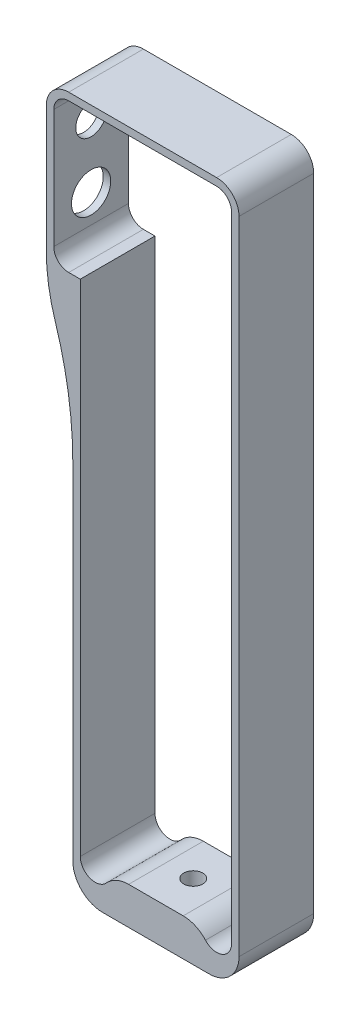
ISO-10303-21;
HEADER;
FILE_DESCRIPTION(('STEP AP214'),'2;1');
FILE_NAME('part.step','',(''),(''),'','','');
FILE_SCHEMA(('AUTOMOTIVE_DESIGN { 1 0 10303 214 1 1 1 1 }'));
ENDSEC;
DATA;
#1=APPLICATION_CONTEXT('core data for automotive mechanical design processes');
#2=APPLICATION_PROTOCOL_DEFINITION('international standard','automotive_design',2000,#1);
#3=PRODUCT_CONTEXT('',#1,'mechanical');
#4=PRODUCT('Part','Part','',(#3));
#5=PRODUCT_RELATED_PRODUCT_CATEGORY('part','',(#4));
#6=PRODUCT_DEFINITION_FORMATION('','',#4);
#7=PRODUCT_DEFINITION_CONTEXT('part definition',#1,'design');
#8=PRODUCT_DEFINITION('design','',#6,#7);
#9=PRODUCT_DEFINITION_SHAPE('','',#8);
#10=(LENGTH_UNIT() NAMED_UNIT(*) SI_UNIT(.MILLI.,.METRE.));
#11=(NAMED_UNIT(*) PLANE_ANGLE_UNIT() SI_UNIT($,.RADIAN.));
#12=(NAMED_UNIT(*) SI_UNIT($,.STERADIAN.) SOLID_ANGLE_UNIT());
#13=UNCERTAINTY_MEASURE_WITH_UNIT(LENGTH_MEASURE(1.E-05),#10,'distance_accuracy_value','');
#14=(GEOMETRIC_REPRESENTATION_CONTEXT(3) GLOBAL_UNCERTAINTY_ASSIGNED_CONTEXT((#13)) GLOBAL_UNIT_ASSIGNED_CONTEXT((#10,
#11,#12)) REPRESENTATION_CONTEXT('',''));
#15=CARTESIAN_POINT('',(0.,0.,0.));
#16=DIRECTION('',(0.,0.,1.));
#17=DIRECTION('',(1.,0.,0.));
#18=AXIS2_PLACEMENT_3D('',#15,#16,#17);
#19=CARTESIAN_POINT('',(-2.,-10.,20.));
#20=DIRECTION('',(1.,0.,0.));
#21=DIRECTION('',(0.,0.,-1.));
#22=AXIS2_PLACEMENT_3D('',#19,#20,#21);
#23=PLANE('',#22);
#24=DIRECTION('',(0.,-1.,0.));
#25=VECTOR('',#24,1.);
#26=CARTESIAN_POINT('',(-2.,-10.,20.));
#27=LINE('',#26,#25);
#28=CARTESIAN_POINT('',(-2.,90.3974781399098,20.));
#29=VERTEX_POINT('',#28);
#30=CARTESIAN_POINT('',(-2.,-2.,20.));
#31=VERTEX_POINT('',#30);
#32=EDGE_CURVE('E227',#29,#31,#27,.T.);
#33=ORIENTED_EDGE('',*,*,#32,.F.);
#34=DIRECTION('',(0.,0.,1.));
#35=VECTOR('',#34,1.);
#36=CARTESIAN_POINT('',(-2.,90.3974781399098,20.));
#37=LINE('',#36,#35);
#38=CARTESIAN_POINT('',(-2.,90.3974781399098,0.));
#39=VERTEX_POINT('',#38);
#40=EDGE_CURVE('E277',#29,#39,#37,.F.);
#41=ORIENTED_EDGE('',*,*,#40,.T.);
#42=DIRECTION('',(0.,-1.,0.));
#43=VECTOR('',#42,1.);
#44=CARTESIAN_POINT('',(-2.,-10.,0.));
#45=LINE('',#44,#43);
#46=CARTESIAN_POINT('',(-2.,-2.,0.));
#47=VERTEX_POINT('',#46);
#48=EDGE_CURVE('E233',#39,#47,#45,.T.);
#49=ORIENTED_EDGE('',*,*,#48,.T.);
#50=DIRECTION('',(0.,0.,-1.));
#51=VECTOR('',#50,1.);
#52=CARTESIAN_POINT('',(-2.,-2.,20.));
#53=LINE('',#52,#51);
#54=EDGE_CURVE('E261',#47,#31,#53,.F.);
#55=ORIENTED_EDGE('',*,*,#54,.T.);
#56=EDGE_LOOP('',(#33,#41,#49,#55));
#57=FACE_BOUND('',#56,.T.);
#58=ADVANCED_FACE('F38',(#57),#23,.F.);
#59=CARTESIAN_POINT('',(0.,0.,20.));
#60=DIRECTION('',(0.,0.,-1.));
#61=DIRECTION('',(-1.,0.,0.));
#62=AXIS2_PLACEMENT_3D('',#59,#60,#61);
#63=PLANE('',#62);
#64=DIRECTION('',(0.,1.,0.));
#65=VECTOR('',#64,1.);
#66=CARTESIAN_POINT('',(42.5,-10.,20.));
#67=LINE('',#66,#65);
#68=CARTESIAN_POINT('',(42.5,-2.,20.));
#69=VERTEX_POINT('',#68);
#70=CARTESIAN_POINT('',(42.5,169.655153446206,20.));
#71=VERTEX_POINT('',#70);
#72=EDGE_CURVE('E239',#69,#71,#67,.T.);
#73=ORIENTED_EDGE('',*,*,#72,.T.);
#74=CARTESIAN_POINT('',(36.5,169.655153446206,20.));
#75=DIRECTION('',(0.,0.,1.));
#76=DIRECTION('',(1.,0.,0.));
#77=AXIS2_PLACEMENT_3D('',#74,#75,#76);
#78=CIRCLE('',#77,6.00000000000001);
#79=CARTESIAN_POINT('',(36.5,175.655153446206,20.));
#80=VERTEX_POINT('',#79);
#81=EDGE_CURVE('E216',#71,#80,#78,.T.);
#82=ORIENTED_EDGE('',*,*,#81,.T.);
#83=DIRECTION('',(-1.,0.,0.));
#84=VECTOR('',#83,1.);
#85=CARTESIAN_POINT('',(36.5,175.655153446206,20.));
#86=LINE('',#85,#84);
#87=CARTESIAN_POINT('',(-3.1,175.655153446206,20.));
#88=VERTEX_POINT('',#87);
#89=EDGE_CURVE('E403',#80,#88,#86,.T.);
#90=ORIENTED_EDGE('',*,*,#89,.T.);
#91=CARTESIAN_POINT('',(-3.1,169.655153446206,20.));
#92=DIRECTION('',(0.,0.,1.));
#93=DIRECTION('',(-1.,0.,0.));
#94=AXIS2_PLACEMENT_3D('',#91,#92,#93);
#95=CIRCLE('',#94,6.);
#96=CARTESIAN_POINT('',(-9.1,169.655153446206,20.));
#97=VERTEX_POINT('',#96);
#98=EDGE_CURVE('E406',#88,#97,#95,.T.);
#99=ORIENTED_EDGE('',*,*,#98,.T.);
#100=DIRECTION('',(0.,-1.,0.));
#101=VECTOR('',#100,1.);
#102=CARTESIAN_POINT('',(-9.1,155.,20.));
#103=LINE('',#102,#101);
#104=CARTESIAN_POINT('',(-9.1,136.,20.));
#105=VERTEX_POINT('',#104);
#106=EDGE_CURVE('E328',#97,#105,#103,.T.);
#107=ORIENTED_EDGE('',*,*,#106,.T.);
#108=CARTESIAN_POINT('',(40.9,136.,20.));
#109=DIRECTION('',(0.,0.,1.));
#110=DIRECTION('',(1.,0.,0.));
#111=AXIS2_PLACEMENT_3D('',#108,#109,#110);
#112=CIRCLE('',#111,50.);
#113=CARTESIAN_POINT('',(-6.73333333333333,120.79915937997,20.));
#114=VERTEX_POINT('',#113);
#115=EDGE_CURVE('E305',#105,#114,#112,.T.);
#116=ORIENTED_EDGE('',*,*,#115,.T.);
#117=CARTESIAN_POINT('',(-102.,90.3974781399098,20.));
#118=DIRECTION('',(0.,0.,-1.));
#119=DIRECTION('',(-1.,0.,0.));
#120=AXIS2_PLACEMENT_3D('',#117,#118,#119);
#121=CIRCLE('',#120,100.);
#122=EDGE_CURVE('E279',#114,#29,#121,.T.);
#123=ORIENTED_EDGE('',*,*,#122,.T.);
#124=ORIENTED_EDGE('',*,*,#32,.T.);
#125=CARTESIAN_POINT('',(6.,-2.,20.));
#126=DIRECTION('',(0.,0.,-1.));
#127=DIRECTION('',(-1.,0.,0.));
#128=AXIS2_PLACEMENT_3D('',#125,#126,#127);
#129=CIRCLE('',#128,8.);
#130=CARTESIAN_POINT('',(6.,-10.,20.));
#131=VERTEX_POINT('',#130);
#132=EDGE_CURVE('E257',#31,#131,#129,.F.);
#133=ORIENTED_EDGE('',*,*,#132,.T.);
#134=DIRECTION('',(1.,0.,0.));
#135=VECTOR('',#134,1.);
#136=CARTESIAN_POINT('',(-2.,-10.,20.));
#137=LINE('',#136,#135);
#138=CARTESIAN_POINT('',(34.5,-10.,20.));
#139=VERTEX_POINT('',#138);
#140=EDGE_CURVE('E230',#131,#139,#137,.T.);
#141=ORIENTED_EDGE('',*,*,#140,.T.);
#142=CARTESIAN_POINT('',(34.5,-2.,20.));
#143=DIRECTION('',(0.,0.,-1.));
#144=DIRECTION('',(-1.,0.,0.));
#145=AXIS2_PLACEMENT_3D('',#142,#143,#144);
#146=CIRCLE('',#145,8.);
#147=EDGE_CURVE('E259',#139,#69,#146,.F.);
#148=ORIENTED_EDGE('',*,*,#147,.T.);
#149=EDGE_LOOP('',(#73,#82,#90,#99,#107,#116,#123,#124,#133,#141,#148));
#150=FACE_BOUND('',#149,.T.);
#151=DIRECTION('',(0.,1.,0.));
#152=VECTOR('',#151,1.);
#153=CARTESIAN_POINT('',(-7.1,155.,20.));
#154=LINE('',#153,#152);
#155=CARTESIAN_POINT('',(-7.1,137.853274797294,20.));
#156=VERTEX_POINT('',#155);
#157=CARTESIAN_POINT('',(-7.1,169.655153446206,20.));
#158=VERTEX_POINT('',#157);
#159=EDGE_CURVE('E292',#156,#158,#154,.T.);
#160=ORIENTED_EDGE('',*,*,#159,.T.);
#161=CARTESIAN_POINT('',(-3.1,169.655153446206,20.));
#162=DIRECTION('',(0.,0.,-1.));
#163=DIRECTION('',(-1.,0.,0.));
#164=AXIS2_PLACEMENT_3D('',#161,#162,#163);
#165=CIRCLE('',#164,4.);
#166=CARTESIAN_POINT('',(-3.1,173.655153446206,20.));
#167=VERTEX_POINT('',#166);
#168=EDGE_CURVE('E53',#158,#167,#165,.T.);
#169=ORIENTED_EDGE('',*,*,#168,.T.);
#170=DIRECTION('',(1.,0.,0.));
#171=VECTOR('',#170,1.);
#172=CARTESIAN_POINT('',(-3.1,173.655153446206,20.));
#173=LINE('',#172,#171);
#174=CARTESIAN_POINT('',(36.5,173.655153446206,20.));
#175=VERTEX_POINT('',#174);
#176=EDGE_CURVE('E210',#167,#175,#173,.T.);
#177=ORIENTED_EDGE('',*,*,#176,.T.);
#178=CARTESIAN_POINT('',(36.5,169.655153446206,20.));
#179=DIRECTION('',(0.,0.,-1.));
#180=DIRECTION('',(1.,0.,0.));
#181=AXIS2_PLACEMENT_3D('',#178,#179,#180);
#182=CIRCLE('',#181,4.);
#183=CARTESIAN_POINT('',(40.5,169.655153446206,20.));
#184=VERTEX_POINT('',#183);
#185=EDGE_CURVE('E404',#175,#184,#182,.T.);
#186=ORIENTED_EDGE('',*,*,#185,.T.);
#187=DIRECTION('',(0.,1.,0.));
#188=VECTOR('',#187,1.);
#189=CARTESIAN_POINT('',(40.5,0.,20.));
#190=LINE('',#189,#188);
#191=CARTESIAN_POINT('',(40.5,0.,20.));
#192=VERTEX_POINT('',#191);
#193=EDGE_CURVE('E358',#192,#184,#190,.T.);
#194=ORIENTED_EDGE('',*,*,#193,.F.);
#195=CARTESIAN_POINT('',(36.5,0.,20.));
#196=DIRECTION('',(0.,0.,1.));
#197=DIRECTION('',(1.,0.,0.));
#198=AXIS2_PLACEMENT_3D('',#195,#196,#197);
#199=CIRCLE('',#198,4.);
#200=CARTESIAN_POINT('',(33.5185760300003,-2.66666666666667,20.));
#201=VERTEX_POINT('',#200);
#202=EDGE_CURVE('E356',#201,#192,#199,.T.);
#203=ORIENTED_EDGE('',*,*,#202,.F.);
#204=CARTESIAN_POINT('',(27.5557280900008,-8.,20.));
#205=DIRECTION('',(0.,0.,-1.));
#206=DIRECTION('',(-1.,0.,0.));
#207=AXIS2_PLACEMENT_3D('',#204,#205,#206);
#208=CIRCLE('',#207,8.);
#209=CARTESIAN_POINT('',(27.5557280900008,0.,20.));
#210=VERTEX_POINT('',#209);
#211=EDGE_CURVE('E255',#201,#210,#208,.F.);
#212=ORIENTED_EDGE('',*,*,#211,.T.);
#213=DIRECTION('',(1.,0.,0.));
#214=VECTOR('',#213,1.);
#215=CARTESIAN_POINT('',(8.,0.,20.));
#216=LINE('',#215,#214);
#217=CARTESIAN_POINT('',(12.9442719099992,0.,20.));
#218=VERTEX_POINT('',#217);
#219=EDGE_CURVE('E352',#218,#210,#216,.T.);
#220=ORIENTED_EDGE('',*,*,#219,.F.);
#221=CARTESIAN_POINT('',(12.9442719099992,-8.,20.));
#222=DIRECTION('',(0.,0.,-1.));
#223=DIRECTION('',(-1.,0.,0.));
#224=AXIS2_PLACEMENT_3D('',#221,#222,#223);
#225=CIRCLE('',#224,8.);
#226=CARTESIAN_POINT('',(6.98142396999972,-2.66666666666667,20.));
#227=VERTEX_POINT('',#226);
#228=EDGE_CURVE('E253',#218,#227,#225,.F.);
#229=ORIENTED_EDGE('',*,*,#228,.T.);
#230=CARTESIAN_POINT('',(4.,0.,20.));
#231=DIRECTION('',(0.,0.,1.));
#232=DIRECTION('',(1.,0.,0.));
#233=AXIS2_PLACEMENT_3D('',#230,#231,#232);
#234=CIRCLE('',#233,4.);
#235=CARTESIAN_POINT('',(0.,0.,20.));
#236=VERTEX_POINT('',#235);
#237=EDGE_CURVE('E349',#236,#227,#234,.T.);
#238=ORIENTED_EDGE('',*,*,#237,.F.);
#239=DIRECTION('',(0.,-1.,0.));
#240=VECTOR('',#239,1.);
#241=CARTESIAN_POINT('',(0.,0.,20.));
#242=LINE('',#241,#240);
#243=CARTESIAN_POINT('',(0.,133.853274797294,20.));
#244=VERTEX_POINT('',#243);
#245=EDGE_CURVE('E361',#244,#236,#242,.T.);
#246=ORIENTED_EDGE('',*,*,#245,.F.);
#247=DIRECTION('',(-1.,0.,0.));
#248=VECTOR('',#247,1.);
#249=CARTESIAN_POINT('',(-7.05197150174398,133.853274797294,20.));
#250=LINE('',#249,#248);
#251=CARTESIAN_POINT('',(-3.1,133.853274797294,20.));
#252=VERTEX_POINT('',#251);
#253=EDGE_CURVE('E294',#244,#252,#250,.T.);
#254=ORIENTED_EDGE('',*,*,#253,.T.);
#255=CARTESIAN_POINT('',(-3.1,137.853274797294,20.));
#256=DIRECTION('',(0.,0.,-1.));
#257=DIRECTION('',(-1.,0.,0.));
#258=AXIS2_PLACEMENT_3D('',#255,#256,#257);
#259=CIRCLE('',#258,4.);
#260=EDGE_CURVE('E46',#252,#156,#259,.T.);
#261=ORIENTED_EDGE('',*,*,#260,.T.);
#262=EDGE_LOOP('',(#160,#169,#177,#186,#194,#203,#212,#220,#229,#238,#246,#254,#261));
#263=FACE_BOUND('',#262,.T.);
#264=ADVANCED_FACE('F291',(#150,#263),#63,.F.);
#265=CARTESIAN_POINT('',(0.,0.,0.));
#266=DIRECTION('',(0.,0.,-1.));
#267=DIRECTION('',(-1.,0.,0.));
#268=AXIS2_PLACEMENT_3D('',#265,#266,#267);
#269=PLANE('',#268);
#270=CARTESIAN_POINT('',(36.5,169.655153446206,0.));
#271=DIRECTION('',(0.,0.,-1.));
#272=DIRECTION('',(-1.,0.,0.));
#273=AXIS2_PLACEMENT_3D('',#270,#271,#272);
#274=CIRCLE('',#273,6.00000000000001);
#275=CARTESIAN_POINT('',(42.5,169.655153446206,0.));
#276=VERTEX_POINT('',#275);
#277=CARTESIAN_POINT('',(36.5,175.655153446206,0.));
#278=VERTEX_POINT('',#277);
#279=EDGE_CURVE('E199',#276,#278,#274,.F.);
#280=ORIENTED_EDGE('',*,*,#279,.F.);
#281=DIRECTION('',(0.,1.,0.));
#282=VECTOR('',#281,1.);
#283=CARTESIAN_POINT('',(42.5,-10.,0.));
#284=LINE('',#283,#282);
#285=CARTESIAN_POINT('',(42.5,-2.,0.));
#286=VERTEX_POINT('',#285);
#287=EDGE_CURVE('E204',#286,#276,#284,.T.);
#288=ORIENTED_EDGE('',*,*,#287,.F.);
#289=CARTESIAN_POINT('',(34.5,-2.,0.));
#290=DIRECTION('',(0.,0.,-1.));
#291=DIRECTION('',(-1.,0.,0.));
#292=AXIS2_PLACEMENT_3D('',#289,#290,#291);
#293=CIRCLE('',#292,8.);
#294=CARTESIAN_POINT('',(34.5,-10.,0.));
#295=VERTEX_POINT('',#294);
#296=EDGE_CURVE('E246',#286,#295,#293,.T.);
#297=ORIENTED_EDGE('',*,*,#296,.T.);
#298=DIRECTION('',(1.,0.,0.));
#299=VECTOR('',#298,1.);
#300=CARTESIAN_POINT('',(-2.,-10.,0.));
#301=LINE('',#300,#299);
#302=CARTESIAN_POINT('',(6.,-10.,0.));
#303=VERTEX_POINT('',#302);
#304=EDGE_CURVE('E228',#303,#295,#301,.T.);
#305=ORIENTED_EDGE('',*,*,#304,.F.);
#306=CARTESIAN_POINT('',(6.,-2.,0.));
#307=DIRECTION('',(0.,0.,-1.));
#308=DIRECTION('',(-1.,0.,0.));
#309=AXIS2_PLACEMENT_3D('',#306,#307,#308);
#310=CIRCLE('',#309,8.);
#311=EDGE_CURVE('E243',#303,#47,#310,.T.);
#312=ORIENTED_EDGE('',*,*,#311,.T.);
#313=ORIENTED_EDGE('',*,*,#48,.F.);
#314=CARTESIAN_POINT('',(-102.,90.3974781399098,0.));
#315=DIRECTION('',(0.,0.,-1.));
#316=DIRECTION('',(-1.,0.,0.));
#317=AXIS2_PLACEMENT_3D('',#314,#315,#316);
#318=CIRCLE('',#317,100.);
#319=CARTESIAN_POINT('',(-6.73333333333333,120.79915937997,0.));
#320=VERTEX_POINT('',#319);
#321=EDGE_CURVE('E281',#39,#320,#318,.F.);
#322=ORIENTED_EDGE('',*,*,#321,.T.);
#323=CARTESIAN_POINT('',(40.9,136.,0.));
#324=DIRECTION('',(0.,0.,-1.));
#325=DIRECTION('',(-1.,0.,0.));
#326=AXIS2_PLACEMENT_3D('',#323,#324,#325);
#327=CIRCLE('',#326,50.);
#328=CARTESIAN_POINT('',(-9.1,136.,0.));
#329=VERTEX_POINT('',#328);
#330=EDGE_CURVE('E338',#329,#320,#327,.F.);
#331=ORIENTED_EDGE('',*,*,#330,.F.);
#332=DIRECTION('',(0.,-1.,0.));
#333=VECTOR('',#332,1.);
#334=CARTESIAN_POINT('',(-9.1,155.,0.));
#335=LINE('',#334,#333);
#336=CARTESIAN_POINT('',(-9.1,169.655153446206,0.));
#337=VERTEX_POINT('',#336);
#338=EDGE_CURVE('E304',#337,#329,#335,.T.);
#339=ORIENTED_EDGE('',*,*,#338,.F.);
#340=CARTESIAN_POINT('',(-3.1,169.655153446206,0.));
#341=DIRECTION('',(0.,0.,-1.));
#342=DIRECTION('',(-1.,0.,0.));
#343=AXIS2_PLACEMENT_3D('',#340,#341,#342);
#344=CIRCLE('',#343,6.);
#345=CARTESIAN_POINT('',(-3.1,175.655153446206,0.));
#346=VERTEX_POINT('',#345);
#347=EDGE_CURVE('E421',#346,#337,#344,.F.);
#348=ORIENTED_EDGE('',*,*,#347,.F.);
#349=DIRECTION('',(-1.,0.,0.));
#350=VECTOR('',#349,1.);
#351=CARTESIAN_POINT('',(36.5,175.655153446206,0.));
#352=LINE('',#351,#350);
#353=EDGE_CURVE('E206',#278,#346,#352,.T.);
#354=ORIENTED_EDGE('',*,*,#353,.F.);
#355=EDGE_LOOP('',(#280,#288,#297,#305,#312,#313,#322,#331,#339,#348,#354));
#356=FACE_BOUND('',#355,.T.);
#357=DIRECTION('',(0.,1.,0.));
#358=VECTOR('',#357,1.);
#359=CARTESIAN_POINT('',(40.5,0.,0.));
#360=LINE('',#359,#358);
#361=CARTESIAN_POINT('',(40.5,0.,0.));
#362=VERTEX_POINT('',#361);
#363=CARTESIAN_POINT('',(40.5,169.655153446206,0.));
#364=VERTEX_POINT('',#363);
#365=EDGE_CURVE('E371',#362,#364,#360,.T.);
#366=ORIENTED_EDGE('',*,*,#365,.T.);
#367=CARTESIAN_POINT('',(36.5,169.655153446206,0.));
#368=DIRECTION('',(0.,0.,-1.));
#369=DIRECTION('',(-1.,0.,0.));
#370=AXIS2_PLACEMENT_3D('',#367,#368,#369);
#371=CIRCLE('',#370,4.);
#372=CARTESIAN_POINT('',(36.5,173.655153446206,0.));
#373=VERTEX_POINT('',#372);
#374=EDGE_CURVE('E61',#373,#364,#371,.T.);
#375=ORIENTED_EDGE('',*,*,#374,.F.);
#376=DIRECTION('',(1.,0.,0.));
#377=VECTOR('',#376,1.);
#378=CARTESIAN_POINT('',(-3.1,173.655153446206,0.));
#379=LINE('',#378,#377);
#380=CARTESIAN_POINT('',(-3.1,173.655153446206,0.));
#381=VERTEX_POINT('',#380);
#382=EDGE_CURVE('E414',#381,#373,#379,.T.);
#383=ORIENTED_EDGE('',*,*,#382,.F.);
#384=CARTESIAN_POINT('',(-3.1,169.655153446206,0.));
#385=DIRECTION('',(0.,0.,-1.));
#386=DIRECTION('',(-1.,0.,0.));
#387=AXIS2_PLACEMENT_3D('',#384,#385,#386);
#388=CIRCLE('',#387,4.);
#389=CARTESIAN_POINT('',(-7.1,169.655153446206,0.));
#390=VERTEX_POINT('',#389);
#391=EDGE_CURVE('E418',#390,#381,#388,.T.);
#392=ORIENTED_EDGE('',*,*,#391,.F.);
#393=DIRECTION('',(0.,1.,0.));
#394=VECTOR('',#393,1.);
#395=CARTESIAN_POINT('',(-7.1,155.,0.));
#396=LINE('',#395,#394);
#397=CARTESIAN_POINT('',(-7.1,137.853274797294,0.));
#398=VERTEX_POINT('',#397);
#399=EDGE_CURVE('E313',#398,#390,#396,.T.);
#400=ORIENTED_EDGE('',*,*,#399,.F.);
#401=CARTESIAN_POINT('',(-3.1,137.853274797294,0.));
#402=DIRECTION('',(0.,0.,-1.));
#403=DIRECTION('',(-1.,0.,0.));
#404=AXIS2_PLACEMENT_3D('',#401,#402,#403);
#405=CIRCLE('',#404,4.);
#406=CARTESIAN_POINT('',(-3.1,133.853274797294,0.));
#407=VERTEX_POINT('',#406);
#408=EDGE_CURVE('E11',#398,#407,#405,.F.);
#409=ORIENTED_EDGE('',*,*,#408,.T.);
#410=DIRECTION('',(-1.,0.,0.));
#411=VECTOR('',#410,1.);
#412=CARTESIAN_POINT('',(-7.05197150174398,133.853274797294,0.));
#413=LINE('',#412,#411);
#414=CARTESIAN_POINT('',(0.,133.853274797294,0.));
#415=VERTEX_POINT('',#414);
#416=EDGE_CURVE('E311',#415,#407,#413,.T.);
#417=ORIENTED_EDGE('',*,*,#416,.F.);
#418=DIRECTION('',(0.,-1.,0.));
#419=VECTOR('',#418,1.);
#420=CARTESIAN_POINT('',(0.,0.,0.));
#421=LINE('',#420,#419);
#422=CARTESIAN_POINT('',(0.,0.,0.));
#423=VERTEX_POINT('',#422);
#424=EDGE_CURVE('E353',#415,#423,#421,.T.);
#425=ORIENTED_EDGE('',*,*,#424,.T.);
#426=CARTESIAN_POINT('',(4.,0.,0.));
#427=DIRECTION('',(0.,0.,1.));
#428=DIRECTION('',(1.,0.,0.));
#429=AXIS2_PLACEMENT_3D('',#426,#427,#428);
#430=CIRCLE('',#429,4.);
#431=CARTESIAN_POINT('',(6.98142396999972,-2.66666666666667,0.));
#432=VERTEX_POINT('',#431);
#433=EDGE_CURVE('E348',#423,#432,#430,.T.);
#434=ORIENTED_EDGE('',*,*,#433,.T.);
#435=CARTESIAN_POINT('',(12.9442719099992,-8.,0.));
#436=DIRECTION('',(0.,0.,-1.));
#437=DIRECTION('',(-1.,0.,0.));
#438=AXIS2_PLACEMENT_3D('',#435,#436,#437);
#439=CIRCLE('',#438,8.);
#440=CARTESIAN_POINT('',(12.9442719099992,0.,0.));
#441=VERTEX_POINT('',#440);
#442=EDGE_CURVE('E238',#432,#441,#439,.T.);
#443=ORIENTED_EDGE('',*,*,#442,.T.);
#444=DIRECTION('',(1.,0.,0.));
#445=VECTOR('',#444,1.);
#446=CARTESIAN_POINT('',(8.,0.,0.));
#447=LINE('',#446,#445);
#448=CARTESIAN_POINT('',(27.5557280900008,0.,0.));
#449=VERTEX_POINT('',#448);
#450=EDGE_CURVE('E366',#441,#449,#447,.T.);
#451=ORIENTED_EDGE('',*,*,#450,.T.);
#452=CARTESIAN_POINT('',(27.5557280900008,-8.,0.));
#453=DIRECTION('',(0.,0.,-1.));
#454=DIRECTION('',(-1.,0.,0.));
#455=AXIS2_PLACEMENT_3D('',#452,#453,#454);
#456=CIRCLE('',#455,8.);
#457=CARTESIAN_POINT('',(33.5185760300003,-2.66666666666667,0.));
#458=VERTEX_POINT('',#457);
#459=EDGE_CURVE('E241',#449,#458,#456,.T.);
#460=ORIENTED_EDGE('',*,*,#459,.T.);
#461=CARTESIAN_POINT('',(36.5,0.,0.));
#462=DIRECTION('',(0.,0.,1.));
#463=DIRECTION('',(1.,0.,0.));
#464=AXIS2_PLACEMENT_3D('',#461,#462,#463);
#465=CIRCLE('',#464,4.);
#466=EDGE_CURVE('E369',#458,#362,#465,.T.);
#467=ORIENTED_EDGE('',*,*,#466,.T.);
#468=EDGE_LOOP('',(#366,#375,#383,#392,#400,#409,#417,#425,#434,#443,#451,#460,#467));
#469=FACE_BOUND('',#468,.T.);
#470=ADVANCED_FACE('F201',(#356,#469),#269,.T.);
#471=CARTESIAN_POINT('',(-2.,-10.,20.));
#472=DIRECTION('',(0.,1.,0.));
#473=DIRECTION('',(-1.,0.,0.));
#474=AXIS2_PLACEMENT_3D('',#471,#472,#473);
#475=PLANE('',#474);
#476=CARTESIAN_POINT('',(20.25,-10.,10.));
#477=DIRECTION('',(0.,-1.,0.));
#478=DIRECTION('',(0.,0.,-1.));
#479=AXIS2_PLACEMENT_3D('',#476,#477,#478);
#480=CIRCLE('',#479,2.55269999999999);
#481=CARTESIAN_POINT('',(20.25,-10.,7.44730000000001));
#482=VERTEX_POINT('',#481);
#483=EDGE_CURVE('E337',#482,#482,#480,.T.);
#484=ORIENTED_EDGE('',*,*,#483,.F.);
#485=EDGE_LOOP('',(#484));
#486=FACE_BOUND('',#485,.T.);
#487=ORIENTED_EDGE('',*,*,#304,.T.);
#488=DIRECTION('',(0.,0.,-1.));
#489=VECTOR('',#488,1.);
#490=CARTESIAN_POINT('',(34.5,-10.,20.));
#491=LINE('',#490,#489);
#492=EDGE_CURVE('E251',#295,#139,#491,.F.);
#493=ORIENTED_EDGE('',*,*,#492,.T.);
#494=ORIENTED_EDGE('',*,*,#140,.F.);
#495=DIRECTION('',(0.,0.,-1.));
#496=VECTOR('',#495,1.);
#497=CARTESIAN_POINT('',(6.,-10.,20.));
#498=LINE('',#497,#496);
#499=EDGE_CURVE('E248',#131,#303,#498,.T.);
#500=ORIENTED_EDGE('',*,*,#499,.T.);
#501=EDGE_LOOP('',(#487,#493,#494,#500));
#502=FACE_BOUND('',#501,.T.);
#503=ADVANCED_FACE('F396',(#486,#502),#475,.F.);
#504=CARTESIAN_POINT('',(42.5,-10.,20.));
#505=DIRECTION('',(-1.,0.,0.));
#506=DIRECTION('',(0.,0.,1.));
#507=AXIS2_PLACEMENT_3D('',#504,#505,#506);
#508=PLANE('',#507);
#509=ORIENTED_EDGE('',*,*,#287,.T.);
#510=DIRECTION('',(0.,0.,1.));
#511=VECTOR('',#510,1.);
#512=CARTESIAN_POINT('',(42.5,169.655153446206,-0.001000000000001));
#513=LINE('',#512,#511);
#514=EDGE_CURVE('E213',#276,#71,#513,.T.);
#515=ORIENTED_EDGE('',*,*,#514,.T.);
#516=ORIENTED_EDGE('',*,*,#72,.F.);
#517=DIRECTION('',(0.,0.,-1.));
#518=VECTOR('',#517,1.);
#519=CARTESIAN_POINT('',(42.5,-2.,20.));
#520=LINE('',#519,#518);
#521=EDGE_CURVE('E226',#69,#286,#520,.T.);
#522=ORIENTED_EDGE('',*,*,#521,.T.);
#523=EDGE_LOOP('',(#509,#515,#516,#522));
#524=FACE_BOUND('',#523,.T.);
#525=ADVANCED_FACE('F224',(#524),#508,.F.);
#526=CARTESIAN_POINT('',(4.,0.,20.));
#527=DIRECTION('',(0.,0.,-1.));
#528=DIRECTION('',(-1.,0.,0.));
#529=AXIS2_PLACEMENT_3D('',#526,#527,#528);
#530=CYLINDRICAL_SURFACE('',#529,4.);
#531=ORIENTED_EDGE('',*,*,#237,.T.);
#532=DIRECTION('',(0.,0.,-1.));
#533=VECTOR('',#532,1.);
#534=CARTESIAN_POINT('',(6.98142396999972,-2.66666666666667,20.));
#535=LINE('',#534,#533);
#536=EDGE_CURVE('E271',#227,#432,#535,.T.);
#537=ORIENTED_EDGE('',*,*,#536,.T.);
#538=ORIENTED_EDGE('',*,*,#433,.F.);
#539=DIRECTION('',(0.,0.,-1.));
#540=VECTOR('',#539,1.);
#541=CARTESIAN_POINT('',(0.,0.,20.));
#542=LINE('',#541,#540);
#543=EDGE_CURVE('E363',#236,#423,#542,.T.);
#544=ORIENTED_EDGE('',*,*,#543,.F.);
#545=EDGE_LOOP('',(#531,#537,#538,#544));
#546=FACE_BOUND('',#545,.T.);
#547=ADVANCED_FACE('F499',(#546),#530,.F.);
#548=CARTESIAN_POINT('',(8.,0.,20.));
#549=DIRECTION('',(0.,1.,0.));
#550=DIRECTION('',(0.,0.,1.));
#551=AXIS2_PLACEMENT_3D('',#548,#549,#550);
#552=PLANE('',#551);
#553=CARTESIAN_POINT('',(20.25,0.,10.));
#554=DIRECTION('',(0.,1.,0.));
#555=DIRECTION('',(0.,0.,1.));
#556=AXIS2_PLACEMENT_3D('',#553,#554,#555);
#557=CIRCLE('',#556,2.55269999999999);
#558=CARTESIAN_POINT('',(20.25,0.,12.5527));
#559=VERTEX_POINT('',#558);
#560=EDGE_CURVE('E345',#559,#559,#557,.T.);
#561=ORIENTED_EDGE('',*,*,#560,.F.);
#562=EDGE_LOOP('',(#561));
#563=FACE_BOUND('',#562,.T.);
#564=ORIENTED_EDGE('',*,*,#219,.T.);
#565=DIRECTION('',(0.,0.,-1.));
#566=VECTOR('',#565,1.);
#567=CARTESIAN_POINT('',(27.5557280900008,0.,20.));
#568=LINE('',#567,#566);
#569=EDGE_CURVE('E266',#210,#449,#568,.T.);
#570=ORIENTED_EDGE('',*,*,#569,.T.);
#571=ORIENTED_EDGE('',*,*,#450,.F.);
#572=DIRECTION('',(0.,0.,-1.));
#573=VECTOR('',#572,1.);
#574=CARTESIAN_POINT('',(12.9442719099992,0.,20.));
#575=LINE('',#574,#573);
#576=EDGE_CURVE('E264',#441,#218,#575,.F.);
#577=ORIENTED_EDGE('',*,*,#576,.T.);
#578=EDGE_LOOP('',(#564,#570,#571,#577));
#579=FACE_BOUND('',#578,.T.);
#580=ADVANCED_FACE('F504',(#563,#579),#552,.T.);
#581=CARTESIAN_POINT('',(36.5,0.,20.));
#582=DIRECTION('',(0.,0.,-1.));
#583=DIRECTION('',(-1.,0.,0.));
#584=AXIS2_PLACEMENT_3D('',#581,#582,#583);
#585=CYLINDRICAL_SURFACE('',#584,4.);
#586=ORIENTED_EDGE('',*,*,#466,.F.);
#587=DIRECTION('',(0.,0.,-1.));
#588=VECTOR('',#587,1.);
#589=CARTESIAN_POINT('',(33.5185760300003,-2.66666666666667,20.));
#590=LINE('',#589,#588);
#591=EDGE_CURVE('E269',#458,#201,#590,.F.);
#592=ORIENTED_EDGE('',*,*,#591,.T.);
#593=ORIENTED_EDGE('',*,*,#202,.T.);
#594=DIRECTION('',(0.,0.,-1.));
#595=VECTOR('',#594,1.);
#596=CARTESIAN_POINT('',(40.5,0.,20.));
#597=LINE('',#596,#595);
#598=EDGE_CURVE('E376',#192,#362,#597,.T.);
#599=ORIENTED_EDGE('',*,*,#598,.T.);
#600=EDGE_LOOP('',(#586,#592,#593,#599));
#601=FACE_BOUND('',#600,.T.);
#602=ADVANCED_FACE('F510',(#601),#585,.F.);
#603=CARTESIAN_POINT('',(40.5,0.,20.));
#604=DIRECTION('',(-1.,0.,0.));
#605=DIRECTION('',(0.,0.,1.));
#606=AXIS2_PLACEMENT_3D('',#603,#604,#605);
#607=PLANE('',#606);
#608=DIRECTION('',(0.,0.,-1.));
#609=VECTOR('',#608,1.);
#610=CARTESIAN_POINT('',(40.5,169.655153446206,-0.001000000000001));
#611=LINE('',#610,#609);
#612=EDGE_CURVE('E221',#184,#364,#611,.T.);
#613=ORIENTED_EDGE('',*,*,#612,.T.);
#614=ORIENTED_EDGE('',*,*,#365,.F.);
#615=ORIENTED_EDGE('',*,*,#598,.F.);
#616=ORIENTED_EDGE('',*,*,#193,.T.);
#617=EDGE_LOOP('',(#613,#614,#615,#616));
#618=FACE_BOUND('',#617,.T.);
#619=ADVANCED_FACE('F516',(#618),#607,.T.);
#620=CARTESIAN_POINT('',(0.,0.,20.));
#621=DIRECTION('',(1.,0.,0.));
#622=DIRECTION('',(0.,0.,-1.));
#623=AXIS2_PLACEMENT_3D('',#620,#621,#622);
#624=PLANE('',#623);
#625=ORIENTED_EDGE('',*,*,#424,.F.);
#626=DIRECTION('',(0.,0.,1.));
#627=VECTOR('',#626,1.);
#628=CARTESIAN_POINT('',(0.,133.853274797294,-20.6273083161224));
#629=LINE('',#628,#627);
#630=EDGE_CURVE('E317',#415,#244,#629,.T.);
#631=ORIENTED_EDGE('',*,*,#630,.T.);
#632=ORIENTED_EDGE('',*,*,#245,.T.);
#633=ORIENTED_EDGE('',*,*,#543,.T.);
#634=EDGE_LOOP('',(#625,#631,#632,#633));
#635=FACE_BOUND('',#634,.T.);
#636=ADVANCED_FACE('F477',(#635),#624,.T.);
#637=CARTESIAN_POINT('',(34.5,-2.,20.));
#638=DIRECTION('',(0.,0.,-1.));
#639=DIRECTION('',(-1.,0.,0.));
#640=AXIS2_PLACEMENT_3D('',#637,#638,#639);
#641=CYLINDRICAL_SURFACE('',#640,8.);
#642=ORIENTED_EDGE('',*,*,#147,.F.);
#643=ORIENTED_EDGE('',*,*,#492,.F.);
#644=ORIENTED_EDGE('',*,*,#296,.F.);
#645=ORIENTED_EDGE('',*,*,#521,.F.);
#646=EDGE_LOOP('',(#642,#643,#644,#645));
#647=FACE_BOUND('',#646,.T.);
#648=ADVANCED_FACE('F399',(#647),#641,.T.);
#649=CARTESIAN_POINT('',(6.,-2.,20.));
#650=DIRECTION('',(0.,0.,-1.));
#651=DIRECTION('',(-1.,0.,0.));
#652=AXIS2_PLACEMENT_3D('',#649,#650,#651);
#653=CYLINDRICAL_SURFACE('',#652,8.);
#654=ORIENTED_EDGE('',*,*,#132,.F.);
#655=ORIENTED_EDGE('',*,*,#54,.F.);
#656=ORIENTED_EDGE('',*,*,#311,.F.);
#657=ORIENTED_EDGE('',*,*,#499,.F.);
#658=EDGE_LOOP('',(#654,#655,#656,#657));
#659=FACE_BOUND('',#658,.T.);
#660=ADVANCED_FACE('F391',(#659),#653,.T.);
#661=CARTESIAN_POINT('',(27.5557280900008,-8.,20.));
#662=DIRECTION('',(0.,0.,-1.));
#663=DIRECTION('',(-1.,0.,0.));
#664=AXIS2_PLACEMENT_3D('',#661,#662,#663);
#665=CYLINDRICAL_SURFACE('',#664,8.);
#666=ORIENTED_EDGE('',*,*,#211,.F.);
#667=ORIENTED_EDGE('',*,*,#591,.F.);
#668=ORIENTED_EDGE('',*,*,#459,.F.);
#669=ORIENTED_EDGE('',*,*,#569,.F.);
#670=EDGE_LOOP('',(#666,#667,#668,#669));
#671=FACE_BOUND('',#670,.T.);
#672=ADVANCED_FACE('F480',(#671),#665,.T.);
#673=CARTESIAN_POINT('',(12.9442719099992,-8.,20.));
#674=DIRECTION('',(0.,0.,-1.));
#675=DIRECTION('',(-1.,0.,0.));
#676=AXIS2_PLACEMENT_3D('',#673,#674,#675);
#677=CYLINDRICAL_SURFACE('',#676,8.);
#678=ORIENTED_EDGE('',*,*,#228,.F.);
#679=ORIENTED_EDGE('',*,*,#576,.F.);
#680=ORIENTED_EDGE('',*,*,#442,.F.);
#681=ORIENTED_EDGE('',*,*,#536,.F.);
#682=EDGE_LOOP('',(#678,#679,#680,#681));
#683=FACE_BOUND('',#682,.T.);
#684=ADVANCED_FACE('F483',(#683),#677,.T.);
#685=CARTESIAN_POINT('',(20.25,-10.,10.));
#686=DIRECTION('',(0.,-1.,0.));
#687=DIRECTION('',(0.,0.,-1.));
#688=AXIS2_PLACEMENT_3D('',#685,#686,#687);
#689=CYLINDRICAL_SURFACE('',#688,2.55269999999999);
#690=ORIENTED_EDGE('',*,*,#483,.T.);
#691=EDGE_LOOP('',(#690));
#692=FACE_BOUND('',#691,.T.);
#693=ORIENTED_EDGE('',*,*,#560,.T.);
#694=EDGE_LOOP('',(#693));
#695=FACE_BOUND('',#694,.T.);
#696=ADVANCED_FACE('F448',(#692,#695),#689,.F.);
#697=CARTESIAN_POINT('',(-9.1,155.,-45.2430591752299));
#698=DIRECTION('',(-1.,0.,0.));
#699=DIRECTION('',(0.,0.,1.));
#700=AXIS2_PLACEMENT_3D('',#697,#698,#699);
#701=PLANE('',#700);
#702=DIRECTION('',(0.,0.,1.));
#703=VECTOR('',#702,1.);
#704=CARTESIAN_POINT('',(-9.1,169.655153446206,-0.001000000000001));
#705=LINE('',#704,#703);
#706=EDGE_CURVE('E429',#337,#97,#705,.T.);
#707=ORIENTED_EDGE('',*,*,#706,.F.);
#708=ORIENTED_EDGE('',*,*,#338,.T.);
#709=DIRECTION('',(0.,0.,1.));
#710=VECTOR('',#709,1.);
#711=CARTESIAN_POINT('',(-9.1,136.,-45.2430591752299));
#712=LINE('',#711,#710);
#713=EDGE_CURVE('E335',#329,#105,#712,.T.);
#714=ORIENTED_EDGE('',*,*,#713,.T.);
#715=ORIENTED_EDGE('',*,*,#106,.F.);
#716=EDGE_LOOP('',(#707,#708,#714,#715));
#717=FACE_BOUND('',#716,.T.);
#718=CARTESIAN_POINT('',(-9.1,162.426275666154,10.));
#719=DIRECTION('',(-1.,0.,0.));
#720=DIRECTION('',(0.,0.,1.));
#721=AXIS2_PLACEMENT_3D('',#718,#719,#720);
#722=CIRCLE('',#721,4.1);
#723=CARTESIAN_POINT('',(-9.1,162.426275666154,14.1));
#724=VERTEX_POINT('',#723);
#725=EDGE_CURVE('E321',#724,#724,#722,.T.);
#726=ORIENTED_EDGE('',*,*,#725,.F.);
#727=EDGE_LOOP('',(#726));
#728=FACE_BOUND('',#727,.T.);
#729=CARTESIAN_POINT('',(-9.1,145.426275666154,10.));
#730=DIRECTION('',(-1.,0.,0.));
#731=DIRECTION('',(0.,0.,1.));
#732=AXIS2_PLACEMENT_3D('',#729,#730,#731);
#733=CIRCLE('',#732,5.25);
#734=CARTESIAN_POINT('',(-9.1,145.426275666154,15.25));
#735=VERTEX_POINT('',#734);
#736=EDGE_CURVE('E325',#735,#735,#733,.T.);
#737=ORIENTED_EDGE('',*,*,#736,.F.);
#738=EDGE_LOOP('',(#737));
#739=FACE_BOUND('',#738,.T.);
#740=ADVANCED_FACE('F444',(#717,#728,#739),#701,.T.);
#741=CARTESIAN_POINT('',(40.9,136.,-45.2430591752299));
#742=DIRECTION('',(0.,0.,1.));
#743=DIRECTION('',(1.,0.,0.));
#744=AXIS2_PLACEMENT_3D('',#741,#742,#743);
#745=CYLINDRICAL_SURFACE('',#744,50.);
#746=ORIENTED_EDGE('',*,*,#330,.T.);
#747=DIRECTION('',(0.,0.,1.));
#748=VECTOR('',#747,1.);
#749=CARTESIAN_POINT('',(-6.73333333333333,120.79915937997,-45.2430591752299));
#750=LINE('',#749,#748);
#751=EDGE_CURVE('E274',#320,#114,#750,.T.);
#752=ORIENTED_EDGE('',*,*,#751,.T.);
#753=ORIENTED_EDGE('',*,*,#115,.F.);
#754=ORIENTED_EDGE('',*,*,#713,.F.);
#755=EDGE_LOOP('',(#746,#752,#753,#754));
#756=FACE_BOUND('',#755,.T.);
#757=ADVANCED_FACE('F447',(#756),#745,.T.);
#758=CARTESIAN_POINT('',(-7.1,155.,-45.2430591752299));
#759=DIRECTION('',(1.,0.,0.));
#760=DIRECTION('',(0.,1.,0.));
#761=AXIS2_PLACEMENT_3D('',#758,#759,#760);
#762=PLANE('',#761);
#763=DIRECTION('',(0.,0.,1.));
#764=VECTOR('',#763,1.);
#765=CARTESIAN_POINT('',(-7.1,169.655153446206,-0.001000000000001));
#766=LINE('',#765,#764);
#767=EDGE_CURVE('E303',#390,#158,#766,.T.);
#768=ORIENTED_EDGE('',*,*,#767,.T.);
#769=ORIENTED_EDGE('',*,*,#159,.F.);
#770=DIRECTION('',(0.,0.,1.));
#771=VECTOR('',#770,1.);
#772=CARTESIAN_POINT('',(-7.1,137.853274797294,0.));
#773=LINE('',#772,#771);
#774=EDGE_CURVE('E286',#156,#398,#773,.F.);
#775=ORIENTED_EDGE('',*,*,#774,.T.);
#776=ORIENTED_EDGE('',*,*,#399,.T.);
#777=EDGE_LOOP('',(#768,#769,#775,#776));
#778=FACE_BOUND('',#777,.T.);
#779=CARTESIAN_POINT('',(-7.1,162.426275666154,10.));
#780=DIRECTION('',(1.,0.,0.));
#781=DIRECTION('',(0.,1.,0.));
#782=AXIS2_PLACEMENT_3D('',#779,#780,#781);
#783=CIRCLE('',#782,4.1);
#784=CARTESIAN_POINT('',(-7.1,162.426275666154,14.1));
#785=VERTEX_POINT('',#784);
#786=EDGE_CURVE('E220',#785,#785,#783,.F.);
#787=ORIENTED_EDGE('',*,*,#786,.T.);
#788=EDGE_LOOP('',(#787));
#789=FACE_BOUND('',#788,.T.);
#790=CARTESIAN_POINT('',(-7.1,145.426275666154,10.));
#791=DIRECTION('',(1.,0.,0.));
#792=DIRECTION('',(0.,1.,0.));
#793=AXIS2_PLACEMENT_3D('',#790,#791,#792);
#794=CIRCLE('',#793,5.25);
#795=CARTESIAN_POINT('',(-7.1,145.426275666154,15.25));
#796=VERTEX_POINT('',#795);
#797=EDGE_CURVE('E319',#796,#796,#794,.F.);
#798=ORIENTED_EDGE('',*,*,#797,.T.);
#799=EDGE_LOOP('',(#798));
#800=FACE_BOUND('',#799,.T.);
#801=ADVANCED_FACE('F299',(#778,#789,#800),#762,.T.);
#802=CARTESIAN_POINT('',(-102.,90.3974781399098,-45.2430591752299));
#803=DIRECTION('',(0.,0.,1.));
#804=DIRECTION('',(1.,0.,0.));
#805=AXIS2_PLACEMENT_3D('',#802,#803,#804);
#806=CYLINDRICAL_SURFACE('',#805,100.);
#807=ORIENTED_EDGE('',*,*,#321,.F.);
#808=ORIENTED_EDGE('',*,*,#40,.F.);
#809=ORIENTED_EDGE('',*,*,#122,.F.);
#810=ORIENTED_EDGE('',*,*,#751,.F.);
#811=EDGE_LOOP('',(#807,#808,#809,#810));
#812=FACE_BOUND('',#811,.T.);
#813=ADVANCED_FACE('F455',(#812),#806,.F.);
#814=CARTESIAN_POINT('',(42.501,145.426275666154,10.));
#815=DIRECTION('',(-1.,0.,0.));
#816=DIRECTION('',(0.,0.,1.));
#817=AXIS2_PLACEMENT_3D('',#814,#815,#816);
#818=CYLINDRICAL_SURFACE('',#817,5.25);
#819=CARTESIAN_POINT('',(-7.1,145.426275666154,15.25));
#820=CARTESIAN_POINT('',(-7.12083333333334,145.426275666154,15.25));
#821=CARTESIAN_POINT('',(-7.14166666666667,145.426275666154,15.25));
#822=CARTESIAN_POINT('',(-7.18333333333334,145.426275666154,15.25));
#823=CARTESIAN_POINT('',(-7.20416666666667,145.426275666154,15.25));
#824=CARTESIAN_POINT('',(-7.24583333333334,145.426275666154,15.25));
#825=CARTESIAN_POINT('',(-7.26666666666667,145.426275666154,15.25));
#826=CARTESIAN_POINT('',(-7.30833333333334,145.426275666154,15.25));
#827=CARTESIAN_POINT('',(-7.32916666666667,145.426275666154,15.25));
#828=CARTESIAN_POINT('',(-7.37083333333334,145.426275666154,15.25));
#829=CARTESIAN_POINT('',(-7.39166666666667,145.426275666154,15.25));
#830=CARTESIAN_POINT('',(-7.43333333333334,145.426275666154,15.25));
#831=CARTESIAN_POINT('',(-7.45416666666667,145.426275666154,15.25));
#832=CARTESIAN_POINT('',(-7.49583333333334,145.426275666154,15.25));
#833=CARTESIAN_POINT('',(-7.51666666666667,145.426275666154,15.25));
#834=CARTESIAN_POINT('',(-7.55833333333334,145.426275666154,15.25));
#835=CARTESIAN_POINT('',(-7.57916666666667,145.426275666154,15.25));
#836=CARTESIAN_POINT('',(-7.62083333333334,145.426275666154,15.25));
#837=CARTESIAN_POINT('',(-7.64166666666667,145.426275666154,15.25));
#838=CARTESIAN_POINT('',(-7.68333333333334,145.426275666154,15.25));
#839=CARTESIAN_POINT('',(-7.70416666666667,145.426275666154,15.25));
#840=CARTESIAN_POINT('',(-7.74583333333334,145.426275666154,15.25));
#841=CARTESIAN_POINT('',(-7.76666666666667,145.426275666154,15.25));
#842=CARTESIAN_POINT('',(-7.80833333333334,145.426275666154,15.25));
#843=CARTESIAN_POINT('',(-7.82916666666667,145.426275666154,15.25));
#844=CARTESIAN_POINT('',(-7.87083333333334,145.426275666154,15.25));
#845=CARTESIAN_POINT('',(-7.89166666666667,145.426275666154,15.25));
#846=CARTESIAN_POINT('',(-7.93333333333334,145.426275666154,15.25));
#847=CARTESIAN_POINT('',(-7.95416666666667,145.426275666154,15.25));
#848=CARTESIAN_POINT('',(-7.99583333333334,145.426275666154,15.25));
#849=CARTESIAN_POINT('',(-8.01666666666667,145.426275666154,15.25));
#850=CARTESIAN_POINT('',(-8.05833333333334,145.426275666154,15.25));
#851=CARTESIAN_POINT('',(-8.07916666666667,145.426275666154,15.25));
#852=CARTESIAN_POINT('',(-8.12083333333334,145.426275666154,15.25));
#853=CARTESIAN_POINT('',(-8.14166666666667,145.426275666154,15.25));
#854=CARTESIAN_POINT('',(-8.18333333333334,145.426275666154,15.25));
#855=CARTESIAN_POINT('',(-8.20416666666667,145.426275666154,15.25));
#856=CARTESIAN_POINT('',(-8.24583333333334,145.426275666154,15.25));
#857=CARTESIAN_POINT('',(-8.26666666666667,145.426275666154,15.25));
#858=CARTESIAN_POINT('',(-8.30833333333334,145.426275666154,15.25));
#859=CARTESIAN_POINT('',(-8.32916666666667,145.426275666154,15.25));
#860=CARTESIAN_POINT('',(-8.37083333333334,145.426275666154,15.25));
#861=CARTESIAN_POINT('',(-8.39166666666667,145.426275666154,15.25));
#862=CARTESIAN_POINT('',(-8.43333333333334,145.426275666154,15.25));
#863=CARTESIAN_POINT('',(-8.45416666666667,145.426275666154,15.25));
#864=CARTESIAN_POINT('',(-8.49583333333334,145.426275666154,15.25));
#865=CARTESIAN_POINT('',(-8.51666666666667,145.426275666154,15.25));
#866=CARTESIAN_POINT('',(-8.55833333333334,145.426275666154,15.25));
#867=CARTESIAN_POINT('',(-8.57916666666667,145.426275666154,15.25));
#868=CARTESIAN_POINT('',(-8.62083333333334,145.426275666154,15.25));
#869=CARTESIAN_POINT('',(-8.64166666666667,145.426275666154,15.25));
#870=CARTESIAN_POINT('',(-8.68333333333334,145.426275666154,15.25));
#871=CARTESIAN_POINT('',(-8.70416666666667,145.426275666154,15.25));
#872=CARTESIAN_POINT('',(-8.74583333333334,145.426275666154,15.25));
#873=CARTESIAN_POINT('',(-8.76666666666667,145.426275666154,15.25));
#874=CARTESIAN_POINT('',(-8.80833333333334,145.426275666154,15.25));
#875=CARTESIAN_POINT('',(-8.82916666666667,145.426275666154,15.25));
#876=CARTESIAN_POINT('',(-8.87083333333334,145.426275666154,15.25));
#877=CARTESIAN_POINT('',(-8.89166666666667,145.426275666154,15.25));
#878=CARTESIAN_POINT('',(-8.93333333333334,145.426275666154,15.25));
#879=CARTESIAN_POINT('',(-8.95416666666667,145.426275666154,15.25));
#880=CARTESIAN_POINT('',(-8.99583333333334,145.426275666154,15.25));
#881=CARTESIAN_POINT('',(-9.01666666666667,145.426275666154,15.25));
#882=CARTESIAN_POINT('',(-9.05833333333334,145.426275666154,15.25));
#883=CARTESIAN_POINT('',(-9.07916666666667,145.426275666154,15.25));
#884=CARTESIAN_POINT('',(-9.1,145.426275666154,15.25));
#885=B_SPLINE_CURVE_WITH_KNOTS('',3,(#819,#820,#821,#822,#823,#824,#825,#826,#827,#828,#829,
#830,#831,#832,#833,#834,#835,#836,#837,#838,#839,#840,#841,#842,#843,#844,#845,#846,#847,#848,
#849,#850,#851,#852,#853,#854,#855,#856,#857,#858,#859,#860,#861,#862,#863,#864,#865,#866,#867,
#868,#869,#870,#871,#872,#873,#874,#875,#876,#877,#878,#879,#880,#881,#882,#883,#884),
.UNSPECIFIED.,.F.,.F.,(4,2,2,2,2,2,2,2,2,2,2,2,2,2,2,2,2,2,2,2,2,2,2,2,2,2,2,2,2,2,2,2,4),(0.,
0.0625000000000001,0.125,0.1875,0.25,0.3125,0.375,0.4375,0.5,0.5625,0.625000000000001,
0.687500000000001,0.750000000000001,0.812500000000001,0.875000000000001,0.937500000000001,1.,
1.0625,1.125,1.1875,1.25,1.3125,1.375,1.4375,1.5,1.5625,1.625,1.6875,1.75,1.8125,1.875,1.9375,
2.),.UNSPECIFIED.);
#886=EDGE_CURVE('BSEAM453',#796,#735,#885,.T.);
#887=ORIENTED_EDGE('',*,*,#797,.F.);
#888=ORIENTED_EDGE('',*,*,#736,.T.);
#889=ORIENTED_EDGE('',*,*,#886,.T.);
#890=ORIENTED_EDGE('',*,*,#886,.F.);
#891=EDGE_LOOP('',(#887,#889,#888,#890));
#892=FACE_BOUND('',#891,.T.);
#893=ADVANCED_FACE('F453',(#892),#818,.F.);
#894=CARTESIAN_POINT('',(-7.05197150174398,133.853274797294,-20.6273083161224));
#895=DIRECTION('',(0.,1.,0.));
#896=DIRECTION('',(0.,0.,1.));
#897=AXIS2_PLACEMENT_3D('',#894,#895,#896);
#898=PLANE('',#897);
#899=ORIENTED_EDGE('',*,*,#416,.T.);
#900=DIRECTION('',(0.,0.,1.));
#901=VECTOR('',#900,1.);
#902=CARTESIAN_POINT('',(-3.1,133.853274797294,20.));
#903=LINE('',#902,#901);
#904=EDGE_CURVE('E283',#407,#252,#903,.T.);
#905=ORIENTED_EDGE('',*,*,#904,.T.);
#906=ORIENTED_EDGE('',*,*,#253,.F.);
#907=ORIENTED_EDGE('',*,*,#630,.F.);
#908=EDGE_LOOP('',(#899,#905,#906,#907));
#909=FACE_BOUND('',#908,.T.);
#910=ADVANCED_FACE('F315',(#909),#898,.T.);
#911=CARTESIAN_POINT('',(-3.1,137.853274797294,-20.6273083161224));
#912=DIRECTION('',(0.,0.,-1.));
#913=DIRECTION('',(-1.,0.,0.));
#914=AXIS2_PLACEMENT_3D('',#911,#912,#913);
#915=CYLINDRICAL_SURFACE('',#914,4.);
#916=ORIENTED_EDGE('',*,*,#408,.F.);
#917=ORIENTED_EDGE('',*,*,#774,.F.);
#918=ORIENTED_EDGE('',*,*,#260,.F.);
#919=ORIENTED_EDGE('',*,*,#904,.F.);
#920=EDGE_LOOP('',(#916,#917,#918,#919));
#921=FACE_BOUND('',#920,.T.);
#922=ADVANCED_FACE('F40',(#921),#915,.F.);
#923=CARTESIAN_POINT('',(42.501,162.426275666154,10.));
#924=DIRECTION('',(-1.,0.,0.));
#925=DIRECTION('',(0.,0.,1.));
#926=AXIS2_PLACEMENT_3D('',#923,#924,#925);
#927=CYLINDRICAL_SURFACE('',#926,4.1);
#928=CARTESIAN_POINT('',(-7.1,162.426275666154,14.1));
#929=CARTESIAN_POINT('',(-7.12083333333334,162.426275666154,14.1));
#930=CARTESIAN_POINT('',(-7.14166666666667,162.426275666154,14.1));
#931=CARTESIAN_POINT('',(-7.18333333333334,162.426275666154,14.1));
#932=CARTESIAN_POINT('',(-7.20416666666667,162.426275666154,14.1));
#933=CARTESIAN_POINT('',(-7.24583333333334,162.426275666154,14.1));
#934=CARTESIAN_POINT('',(-7.26666666666667,162.426275666154,14.1));
#935=CARTESIAN_POINT('',(-7.30833333333334,162.426275666154,14.1));
#936=CARTESIAN_POINT('',(-7.32916666666667,162.426275666154,14.1));
#937=CARTESIAN_POINT('',(-7.37083333333334,162.426275666154,14.1));
#938=CARTESIAN_POINT('',(-7.39166666666667,162.426275666154,14.1));
#939=CARTESIAN_POINT('',(-7.43333333333334,162.426275666154,14.1));
#940=CARTESIAN_POINT('',(-7.45416666666667,162.426275666154,14.1));
#941=CARTESIAN_POINT('',(-7.49583333333334,162.426275666154,14.1));
#942=CARTESIAN_POINT('',(-7.51666666666667,162.426275666154,14.1));
#943=CARTESIAN_POINT('',(-7.55833333333334,162.426275666154,14.1));
#944=CARTESIAN_POINT('',(-7.57916666666667,162.426275666154,14.1));
#945=CARTESIAN_POINT('',(-7.62083333333334,162.426275666154,14.1));
#946=CARTESIAN_POINT('',(-7.64166666666667,162.426275666154,14.1));
#947=CARTESIAN_POINT('',(-7.68333333333334,162.426275666154,14.1));
#948=CARTESIAN_POINT('',(-7.70416666666667,162.426275666154,14.1));
#949=CARTESIAN_POINT('',(-7.74583333333334,162.426275666154,14.1));
#950=CARTESIAN_POINT('',(-7.76666666666667,162.426275666154,14.1));
#951=CARTESIAN_POINT('',(-7.80833333333334,162.426275666154,14.1));
#952=CARTESIAN_POINT('',(-7.82916666666667,162.426275666154,14.1));
#953=CARTESIAN_POINT('',(-7.87083333333334,162.426275666154,14.1));
#954=CARTESIAN_POINT('',(-7.89166666666667,162.426275666154,14.1));
#955=CARTESIAN_POINT('',(-7.93333333333334,162.426275666154,14.1));
#956=CARTESIAN_POINT('',(-7.95416666666667,162.426275666154,14.1));
#957=CARTESIAN_POINT('',(-7.99583333333334,162.426275666154,14.1));
#958=CARTESIAN_POINT('',(-8.01666666666667,162.426275666154,14.1));
#959=CARTESIAN_POINT('',(-8.05833333333334,162.426275666154,14.1));
#960=CARTESIAN_POINT('',(-8.07916666666667,162.426275666154,14.1));
#961=CARTESIAN_POINT('',(-8.12083333333334,162.426275666154,14.1));
#962=CARTESIAN_POINT('',(-8.14166666666667,162.426275666154,14.1));
#963=CARTESIAN_POINT('',(-8.18333333333334,162.426275666154,14.1));
#964=CARTESIAN_POINT('',(-8.20416666666667,162.426275666154,14.1));
#965=CARTESIAN_POINT('',(-8.24583333333334,162.426275666154,14.1));
#966=CARTESIAN_POINT('',(-8.26666666666667,162.426275666154,14.1));
#967=CARTESIAN_POINT('',(-8.30833333333334,162.426275666154,14.1));
#968=CARTESIAN_POINT('',(-8.32916666666667,162.426275666154,14.1));
#969=CARTESIAN_POINT('',(-8.37083333333334,162.426275666154,14.1));
#970=CARTESIAN_POINT('',(-8.39166666666667,162.426275666154,14.1));
#971=CARTESIAN_POINT('',(-8.43333333333334,162.426275666154,14.1));
#972=CARTESIAN_POINT('',(-8.45416666666667,162.426275666154,14.1));
#973=CARTESIAN_POINT('',(-8.49583333333334,162.426275666154,14.1));
#974=CARTESIAN_POINT('',(-8.51666666666667,162.426275666154,14.1));
#975=CARTESIAN_POINT('',(-8.55833333333334,162.426275666154,14.1));
#976=CARTESIAN_POINT('',(-8.57916666666667,162.426275666154,14.1));
#977=CARTESIAN_POINT('',(-8.62083333333334,162.426275666154,14.1));
#978=CARTESIAN_POINT('',(-8.64166666666667,162.426275666154,14.1));
#979=CARTESIAN_POINT('',(-8.68333333333334,162.426275666154,14.1));
#980=CARTESIAN_POINT('',(-8.70416666666667,162.426275666154,14.1));
#981=CARTESIAN_POINT('',(-8.74583333333334,162.426275666154,14.1));
#982=CARTESIAN_POINT('',(-8.76666666666667,162.426275666154,14.1));
#983=CARTESIAN_POINT('',(-8.80833333333334,162.426275666154,14.1));
#984=CARTESIAN_POINT('',(-8.82916666666667,162.426275666154,14.1));
#985=CARTESIAN_POINT('',(-8.87083333333334,162.426275666154,14.1));
#986=CARTESIAN_POINT('',(-8.89166666666667,162.426275666154,14.1));
#987=CARTESIAN_POINT('',(-8.93333333333334,162.426275666154,14.1));
#988=CARTESIAN_POINT('',(-8.95416666666667,162.426275666154,14.1));
#989=CARTESIAN_POINT('',(-8.99583333333334,162.426275666154,14.1));
#990=CARTESIAN_POINT('',(-9.01666666666667,162.426275666154,14.1));
#991=CARTESIAN_POINT('',(-9.05833333333334,162.426275666154,14.1));
#992=CARTESIAN_POINT('',(-9.07916666666667,162.426275666154,14.1));
#993=CARTESIAN_POINT('',(-9.1,162.426275666154,14.1));
#994=B_SPLINE_CURVE_WITH_KNOTS('',3,(#928,#929,#930,#931,#932,#933,#934,#935,#936,#937,#938,
#939,#940,#941,#942,#943,#944,#945,#946,#947,#948,#949,#950,#951,#952,#953,#954,#955,#956,#957,
#958,#959,#960,#961,#962,#963,#964,#965,#966,#967,#968,#969,#970,#971,#972,#973,#974,#975,#976,
#977,#978,#979,#980,#981,#982,#983,#984,#985,#986,#987,#988,#989,#990,#991,#992,#993),
.UNSPECIFIED.,.F.,.F.,(4,2,2,2,2,2,2,2,2,2,2,2,2,2,2,2,2,2,2,2,2,2,2,2,2,2,2,2,2,2,2,2,4),(0.,
0.0625000000000001,0.125,0.1875,0.25,0.3125,0.375,0.4375,0.5,0.5625,0.625000000000001,
0.687500000000001,0.750000000000001,0.812500000000001,0.875000000000001,0.937500000000001,1.,
1.0625,1.125,1.1875,1.25,1.3125,1.375,1.4375,1.5,1.5625,1.625,1.6875,1.75,1.8125,1.875,1.9375,
2.),.UNSPECIFIED.);
#995=EDGE_CURVE('BSEAM438',#785,#724,#994,.T.);
#996=ORIENTED_EDGE('',*,*,#786,.F.);
#997=ORIENTED_EDGE('',*,*,#725,.T.);
#998=ORIENTED_EDGE('',*,*,#995,.T.);
#999=ORIENTED_EDGE('',*,*,#995,.F.);
#1000=EDGE_LOOP('',(#996,#998,#997,#999));
#1001=FACE_BOUND('',#1000,.T.);
#1002=ADVANCED_FACE('F438',(#1001),#927,.F.);
#1003=CARTESIAN_POINT('',(36.5,169.655153446206,-51.9476659725921));
#1004=DIRECTION('',(0.,0.,1.));
#1005=DIRECTION('',(1.,0.,0.));
#1006=AXIS2_PLACEMENT_3D('',#1003,#1004,#1005);
#1007=CYLINDRICAL_SURFACE('',#1006,6.00000000000001);
#1008=ORIENTED_EDGE('',*,*,#514,.F.);
#1009=ORIENTED_EDGE('',*,*,#279,.T.);
#1010=DIRECTION('',(0.,0.,1.));
#1011=VECTOR('',#1010,1.);
#1012=CARTESIAN_POINT('',(36.5,175.655153446206,-51.9476659725921));
#1013=LINE('',#1012,#1011);
#1014=EDGE_CURVE('E209',#278,#80,#1013,.T.);
#1015=ORIENTED_EDGE('',*,*,#1014,.T.);
#1016=ORIENTED_EDGE('',*,*,#81,.F.);
#1017=EDGE_LOOP('',(#1008,#1009,#1015,#1016));
#1018=FACE_BOUND('',#1017,.T.);
#1019=ADVANCED_FACE('F214',(#1018),#1007,.T.);
#1020=CARTESIAN_POINT('',(36.5,175.655153446206,-51.9476659725921));
#1021=DIRECTION('',(0.,1.,0.));
#1022=DIRECTION('',(0.,0.,1.));
#1023=AXIS2_PLACEMENT_3D('',#1020,#1021,#1022);
#1024=PLANE('',#1023);
#1025=ORIENTED_EDGE('',*,*,#1014,.F.);
#1026=ORIENTED_EDGE('',*,*,#353,.T.);
#1027=DIRECTION('',(0.,0.,1.));
#1028=VECTOR('',#1027,1.);
#1029=CARTESIAN_POINT('',(-3.1,175.655153446206,-51.9476659725921));
#1030=LINE('',#1029,#1028);
#1031=EDGE_CURVE('E423',#346,#88,#1030,.T.);
#1032=ORIENTED_EDGE('',*,*,#1031,.T.);
#1033=ORIENTED_EDGE('',*,*,#89,.F.);
#1034=EDGE_LOOP('',(#1025,#1026,#1032,#1033));
#1035=FACE_BOUND('',#1034,.T.);
#1036=ADVANCED_FACE('F533',(#1035),#1024,.T.);
#1037=CARTESIAN_POINT('',(-3.1,169.655153446206,-51.9476659725921));
#1038=DIRECTION('',(0.,0.,1.));
#1039=DIRECTION('',(1.,0.,0.));
#1040=AXIS2_PLACEMENT_3D('',#1037,#1038,#1039);
#1041=CYLINDRICAL_SURFACE('',#1040,6.);
#1042=ORIENTED_EDGE('',*,*,#1031,.F.);
#1043=ORIENTED_EDGE('',*,*,#347,.T.);
#1044=ORIENTED_EDGE('',*,*,#706,.T.);
#1045=ORIENTED_EDGE('',*,*,#98,.F.);
#1046=EDGE_LOOP('',(#1042,#1043,#1044,#1045));
#1047=FACE_BOUND('',#1046,.T.);
#1048=ADVANCED_FACE('F526',(#1047),#1041,.T.);
#1049=CARTESIAN_POINT('',(-3.1,169.655153446206,-51.9476659725921));
#1050=DIRECTION('',(0.,0.,1.));
#1051=DIRECTION('',(1.,0.,0.));
#1052=AXIS2_PLACEMENT_3D('',#1049,#1050,#1051);
#1053=CYLINDRICAL_SURFACE('',#1052,4.);
#1054=ORIENTED_EDGE('',*,*,#767,.F.);
#1055=ORIENTED_EDGE('',*,*,#391,.T.);
#1056=DIRECTION('',(0.,0.,1.));
#1057=VECTOR('',#1056,1.);
#1058=CARTESIAN_POINT('',(-3.1,173.655153446206,-51.9476659725921));
#1059=LINE('',#1058,#1057);
#1060=EDGE_CURVE('E417',#381,#167,#1059,.T.);
#1061=ORIENTED_EDGE('',*,*,#1060,.T.);
#1062=ORIENTED_EDGE('',*,*,#168,.F.);
#1063=EDGE_LOOP('',(#1054,#1055,#1061,#1062));
#1064=FACE_BOUND('',#1063,.T.);
#1065=ADVANCED_FACE('F524',(#1064),#1053,.F.);
#1066=CARTESIAN_POINT('',(-3.1,173.655153446206,-51.9476659725921));
#1067=DIRECTION('',(0.,-1.,0.));
#1068=DIRECTION('',(0.,0.,-1.));
#1069=AXIS2_PLACEMENT_3D('',#1066,#1067,#1068);
#1070=PLANE('',#1069);
#1071=ORIENTED_EDGE('',*,*,#1060,.F.);
#1072=ORIENTED_EDGE('',*,*,#382,.T.);
#1073=DIRECTION('',(0.,0.,1.));
#1074=VECTOR('',#1073,1.);
#1075=CARTESIAN_POINT('',(36.5,173.655153446206,-51.9476659725921));
#1076=LINE('',#1075,#1074);
#1077=EDGE_CURVE('E413',#373,#175,#1076,.T.);
#1078=ORIENTED_EDGE('',*,*,#1077,.T.);
#1079=ORIENTED_EDGE('',*,*,#176,.F.);
#1080=EDGE_LOOP('',(#1071,#1072,#1078,#1079));
#1081=FACE_BOUND('',#1080,.T.);
#1082=ADVANCED_FACE('F523',(#1081),#1070,.T.);
#1083=CARTESIAN_POINT('',(36.5,169.655153446206,-51.9476659725921));
#1084=DIRECTION('',(0.,0.,1.));
#1085=DIRECTION('',(1.,0.,0.));
#1086=AXIS2_PLACEMENT_3D('',#1083,#1084,#1085);
#1087=CYLINDRICAL_SURFACE('',#1086,4.);
#1088=ORIENTED_EDGE('',*,*,#1077,.F.);
#1089=ORIENTED_EDGE('',*,*,#374,.T.);
#1090=ORIENTED_EDGE('',*,*,#612,.F.);
#1091=ORIENTED_EDGE('',*,*,#185,.F.);
#1092=EDGE_LOOP('',(#1088,#1089,#1090,#1091));
#1093=FACE_BOUND('',#1092,.T.);
#1094=ADVANCED_FACE('F519',(#1093),#1087,.F.);
#1095=CLOSED_SHELL('',(#58,#264,#470,#503,#525,#547,#580,#602,#619,#636,#648,#660,#672,#684,
#696,#740,#757,#801,#813,#893,#910,#922,#1002,#1019,#1036,#1048,#1065,#1082,#1094));
#1096=MANIFOLD_SOLID_BREP('B2',#1095);
#1097=ADVANCED_BREP_SHAPE_REPRESENTATION('',(#18,#1096),#14);
#1098=SHAPE_DEFINITION_REPRESENTATION(#9,#1097);
ENDSEC;
END-ISO-10303-21;
